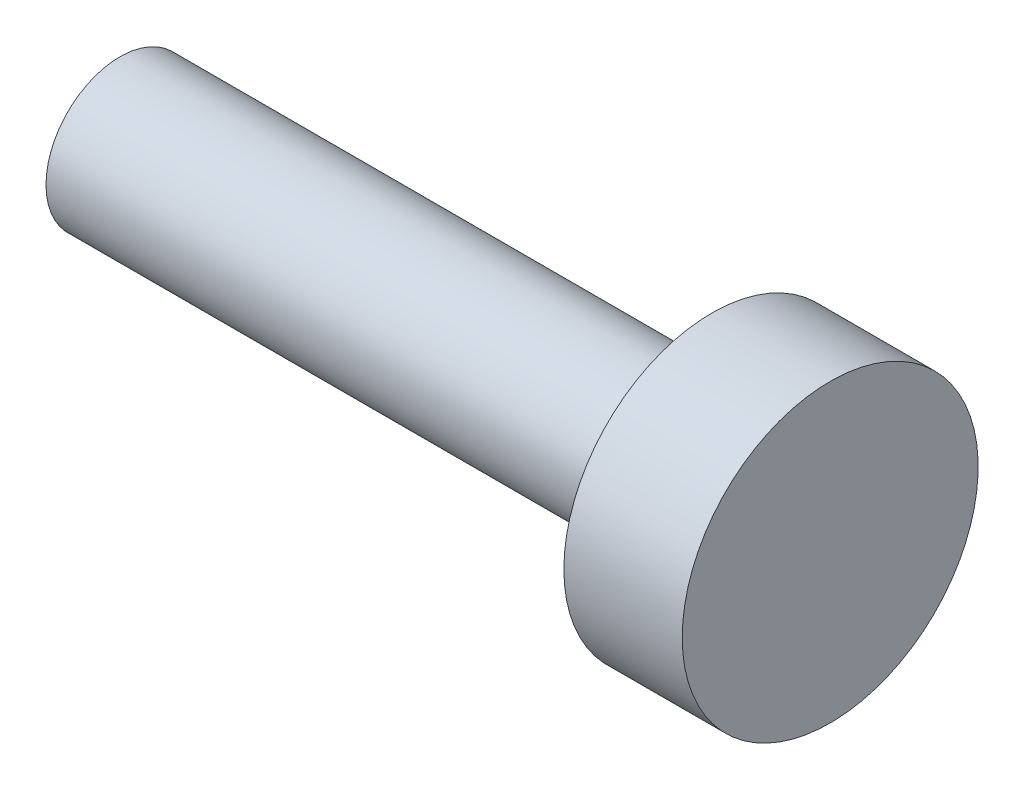
ISO-10303-21;
HEADER;
FILE_DESCRIPTION(('STEP AP214'),'2;1');
FILE_NAME('part.step','',(''),(''),'','','');
FILE_SCHEMA(('AUTOMOTIVE_DESIGN { 1 0 10303 214 1 1 1 1 }'));
ENDSEC;
DATA;
#1=APPLICATION_CONTEXT('core data for automotive mechanical design processes');
#2=APPLICATION_PROTOCOL_DEFINITION('international standard','automotive_design',2000,#1);
#3=PRODUCT_CONTEXT('',#1,'mechanical');
#4=PRODUCT('Part','Part','',(#3));
#5=PRODUCT_RELATED_PRODUCT_CATEGORY('part','',(#4));
#6=PRODUCT_DEFINITION_FORMATION('','',#4);
#7=PRODUCT_DEFINITION_CONTEXT('part definition',#1,'design');
#8=PRODUCT_DEFINITION('design','',#6,#7);
#9=PRODUCT_DEFINITION_SHAPE('','',#8);
#10=(LENGTH_UNIT() NAMED_UNIT(*) SI_UNIT(.MILLI.,.METRE.));
#11=(NAMED_UNIT(*) PLANE_ANGLE_UNIT() SI_UNIT($,.RADIAN.));
#12=(NAMED_UNIT(*) SI_UNIT($,.STERADIAN.) SOLID_ANGLE_UNIT());
#13=UNCERTAINTY_MEASURE_WITH_UNIT(LENGTH_MEASURE(1.E-05),#10,'distance_accuracy_value','');
#14=(GEOMETRIC_REPRESENTATION_CONTEXT(3) GLOBAL_UNCERTAINTY_ASSIGNED_CONTEXT((#13)) GLOBAL_UNIT_ASSIGNED_CONTEXT((#10,
#11,#12)) REPRESENTATION_CONTEXT('',''));
#15=CARTESIAN_POINT('',(0.,0.,0.));
#16=DIRECTION('',(0.,0.,1.));
#17=DIRECTION('',(1.,0.,0.));
#18=AXIS2_PLACEMENT_3D('',#15,#16,#17);
#19=CARTESIAN_POINT('',(12.,0.,0.));
#20=DIRECTION('',(-1.,0.,0.));
#21=DIRECTION('',(0.,0.,1.));
#22=AXIS2_PLACEMENT_3D('',#19,#20,#21);
#23=PLANE('',#22);
#24=CARTESIAN_POINT('',(12.,0.,0.));
#25=DIRECTION('',(-1.,0.,0.));
#26=DIRECTION('',(0.,0.,1.));
#27=AXIS2_PLACEMENT_3D('',#24,#25,#26);
#28=CIRCLE('',#27,2.5);
#29=CARTESIAN_POINT('',(12.,0.,2.5));
#30=VERTEX_POINT('',#29);
#31=EDGE_CURVE('E10',#30,#30,#28,.T.);
#32=ORIENTED_EDGE('',*,*,#31,.F.);
#33=EDGE_LOOP('',(#32));
#34=FACE_BOUND('',#33,.T.);
#35=ADVANCED_FACE('F43',(#34),#23,.F.);
#36=CARTESIAN_POINT('',(0.,0.,0.));
#37=DIRECTION('',(-1.,0.,0.));
#38=DIRECTION('',(0.,0.,1.));
#39=AXIS2_PLACEMENT_3D('',#36,#37,#38);
#40=CYLINDRICAL_SURFACE('',#39,2.5);
#41=CARTESIAN_POINT('',(10.,0.,0.));
#42=DIRECTION('',(-1.,0.,0.));
#43=DIRECTION('',(0.,0.,1.));
#44=AXIS2_PLACEMENT_3D('',#41,#42,#43);
#45=CIRCLE('',#44,2.5);
#46=CARTESIAN_POINT('',(10.,0.,2.5));
#47=VERTEX_POINT('',#46);
#48=EDGE_CURVE('E50',#47,#47,#45,.T.);
#49=ORIENTED_EDGE('',*,*,#48,.F.);
#50=EDGE_LOOP('',(#49));
#51=FACE_BOUND('',#50,.T.);
#52=ORIENTED_EDGE('',*,*,#31,.T.);
#53=EDGE_LOOP('',(#52));
#54=FACE_BOUND('',#53,.T.);
#55=ADVANCED_FACE('F77',(#51,#54),#40,.T.);
#56=CARTESIAN_POINT('',(10.,2.5,0.));
#57=DIRECTION('',(1.,0.,0.));
#58=DIRECTION('',(0.,0.,-1.));
#59=AXIS2_PLACEMENT_3D('',#56,#57,#58);
#60=PLANE('',#59);
#61=CARTESIAN_POINT('',(10.,0.,0.));
#62=DIRECTION('',(-1.,0.,0.));
#63=DIRECTION('',(0.,0.,1.));
#64=AXIS2_PLACEMENT_3D('',#61,#62,#63);
#65=CIRCLE('',#64,1.25);
#66=CARTESIAN_POINT('',(10.,0.,1.25));
#67=VERTEX_POINT('',#66);
#68=EDGE_CURVE('E55',#67,#67,#65,.T.);
#69=ORIENTED_EDGE('',*,*,#68,.F.);
#70=EDGE_LOOP('',(#69));
#71=FACE_BOUND('',#70,.T.);
#72=ORIENTED_EDGE('',*,*,#48,.T.);
#73=EDGE_LOOP('',(#72));
#74=FACE_BOUND('',#73,.T.);
#75=ADVANCED_FACE('F72',(#71,#74),#60,.F.);
#76=CARTESIAN_POINT('',(0.,0.,0.));
#77=DIRECTION('',(-1.,0.,0.));
#78=DIRECTION('',(0.,0.,1.));
#79=AXIS2_PLACEMENT_3D('',#76,#77,#78);
#80=CYLINDRICAL_SURFACE('',#79,1.25);
#81=CARTESIAN_POINT('',(0.,0.,0.));
#82=DIRECTION('',(-1.,0.,0.));
#83=DIRECTION('',(0.,0.,1.));
#84=AXIS2_PLACEMENT_3D('',#81,#82,#83);
#85=CIRCLE('',#84,1.25);
#86=CARTESIAN_POINT('',(0.,0.,1.25));
#87=VERTEX_POINT('',#86);
#88=EDGE_CURVE('E60',#87,#87,#85,.T.);
#89=ORIENTED_EDGE('',*,*,#88,.F.);
#90=EDGE_LOOP('',(#89));
#91=FACE_BOUND('',#90,.T.);
#92=ORIENTED_EDGE('',*,*,#68,.T.);
#93=EDGE_LOOP('',(#92));
#94=FACE_BOUND('',#93,.T.);
#95=ADVANCED_FACE('F69',(#91,#94),#80,.T.);
#96=CARTESIAN_POINT('',(0.,0.,0.));
#97=DIRECTION('',(1.,0.,0.));
#98=DIRECTION('',(0.,0.,-1.));
#99=AXIS2_PLACEMENT_3D('',#96,#97,#98);
#100=PLANE('',#99);
#101=ORIENTED_EDGE('',*,*,#88,.T.);
#102=EDGE_LOOP('',(#101));
#103=FACE_BOUND('',#102,.T.);
#104=ADVANCED_FACE('F67',(#103),#100,.F.);
#105=CLOSED_SHELL('',(#35,#55,#75,#95,#104));
#106=MANIFOLD_SOLID_BREP('B2',#105);
#107=ADVANCED_BREP_SHAPE_REPRESENTATION('',(#18,#106),#14);
#108=SHAPE_DEFINITION_REPRESENTATION(#9,#107);
ENDSEC;
END-ISO-10303-21;
